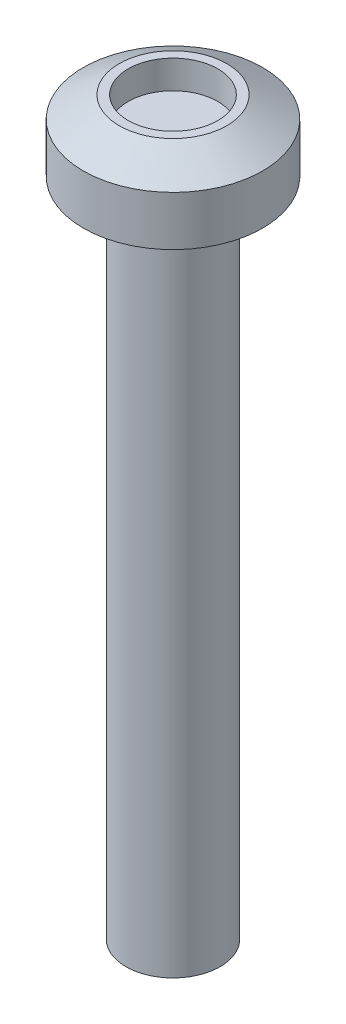
ISO-10303-21;
HEADER;
FILE_DESCRIPTION(('STEP AP214'),'2;1');
FILE_NAME('part.step','',(''),(''),'','','');
FILE_SCHEMA(('AUTOMOTIVE_DESIGN { 1 0 10303 214 1 1 1 1 }'));
ENDSEC;
DATA;
#1=APPLICATION_CONTEXT('core data for automotive mechanical design processes');
#2=APPLICATION_PROTOCOL_DEFINITION('international standard','automotive_design',2000,#1);
#3=PRODUCT_CONTEXT('',#1,'mechanical');
#4=PRODUCT('Part','Part','',(#3));
#5=PRODUCT_RELATED_PRODUCT_CATEGORY('part','',(#4));
#6=PRODUCT_DEFINITION_FORMATION('','',#4);
#7=PRODUCT_DEFINITION_CONTEXT('part definition',#1,'design');
#8=PRODUCT_DEFINITION('design','',#6,#7);
#9=PRODUCT_DEFINITION_SHAPE('','',#8);
#10=(LENGTH_UNIT() NAMED_UNIT(*) SI_UNIT(.MILLI.,.METRE.));
#11=(NAMED_UNIT(*) PLANE_ANGLE_UNIT() SI_UNIT($,.RADIAN.));
#12=(NAMED_UNIT(*) SI_UNIT($,.STERADIAN.) SOLID_ANGLE_UNIT());
#13=UNCERTAINTY_MEASURE_WITH_UNIT(LENGTH_MEASURE(1.E-05),#10,'distance_accuracy_value','');
#14=(GEOMETRIC_REPRESENTATION_CONTEXT(3) GLOBAL_UNCERTAINTY_ASSIGNED_CONTEXT((#13)) GLOBAL_UNIT_ASSIGNED_CONTEXT((#10,
#11,#12)) REPRESENTATION_CONTEXT('',''));
#15=CARTESIAN_POINT('',(0.,0.,0.));
#16=DIRECTION('',(0.,0.,1.));
#17=DIRECTION('',(1.,0.,0.));
#18=AXIS2_PLACEMENT_3D('',#15,#16,#17);
#19=CARTESIAN_POINT('',(0.,-14.,0.));
#20=DIRECTION('',(0.,-1.,0.));
#21=DIRECTION('',(0.,0.,-1.));
#22=AXIS2_PLACEMENT_3D('',#19,#20,#21);
#23=PLANE('',#22);
#24=CARTESIAN_POINT('',(0.,-14.,0.));
#25=DIRECTION('',(0.,-1.,0.));
#26=DIRECTION('',(0.,0.,-1.));
#27=AXIS2_PLACEMENT_3D('',#24,#25,#26);
#28=CIRCLE('',#27,1.);
#29=CARTESIAN_POINT('',(0.,-14.,-1.));
#30=VERTEX_POINT('',#29);
#31=EDGE_CURVE('E10',#30,#30,#28,.T.);
#32=ORIENTED_EDGE('',*,*,#31,.T.);
#33=EDGE_LOOP('',(#32));
#34=FACE_BOUND('',#33,.T.);
#35=ADVANCED_FACE('F39',(#34),#23,.T.);
#36=CARTESIAN_POINT('',(0.,-10.,0.));
#37=DIRECTION('',(0.,-1.,0.));
#38=DIRECTION('',(0.,0.,-1.));
#39=AXIS2_PLACEMENT_3D('',#36,#37,#38);
#40=CYLINDRICAL_SURFACE('',#39,1.);
#41=CARTESIAN_POINT('',(0.,0.,0.));
#42=DIRECTION('',(0.,-1.,0.));
#43=DIRECTION('',(0.,0.,-1.));
#44=AXIS2_PLACEMENT_3D('',#41,#42,#43);
#45=CIRCLE('',#44,1.);
#46=CARTESIAN_POINT('',(0.,0.,-1.));
#47=VERTEX_POINT('',#46);
#48=EDGE_CURVE('E45',#47,#47,#45,.T.);
#49=ORIENTED_EDGE('',*,*,#48,.T.);
#50=EDGE_LOOP('',(#49));
#51=FACE_BOUND('',#50,.T.);
#52=ORIENTED_EDGE('',*,*,#31,.F.);
#53=EDGE_LOOP('',(#52));
#54=FACE_BOUND('',#53,.T.);
#55=ADVANCED_FACE('F97',(#51,#54),#40,.T.);
#56=CARTESIAN_POINT('',(1.,0.,0.));
#57=DIRECTION('',(0.,-1.,0.));
#58=DIRECTION('',(0.,0.,-1.));
#59=AXIS2_PLACEMENT_3D('',#56,#57,#58);
#60=PLANE('',#59);
#61=CARTESIAN_POINT('',(0.,0.,0.));
#62=DIRECTION('',(0.,-1.,0.));
#63=DIRECTION('',(0.,0.,-1.));
#64=AXIS2_PLACEMENT_3D('',#61,#62,#63);
#65=CIRCLE('',#64,1.9);
#66=CARTESIAN_POINT('',(0.,0.,-1.9));
#67=VERTEX_POINT('',#66);
#68=EDGE_CURVE('E49',#67,#67,#65,.T.);
#69=ORIENTED_EDGE('',*,*,#68,.T.);
#70=EDGE_LOOP('',(#69));
#71=FACE_BOUND('',#70,.T.);
#72=ORIENTED_EDGE('',*,*,#48,.F.);
#73=EDGE_LOOP('',(#72));
#74=FACE_BOUND('',#73,.T.);
#75=ADVANCED_FACE('F91',(#71,#74),#60,.T.);
#76=CARTESIAN_POINT('',(0.,-10.,0.));
#77=DIRECTION('',(0.,-1.,0.));
#78=DIRECTION('',(0.,0.,-1.));
#79=AXIS2_PLACEMENT_3D('',#76,#77,#78);
#80=CYLINDRICAL_SURFACE('',#79,1.9);
#81=CARTESIAN_POINT('',(0.,1.05,0.));
#82=DIRECTION('',(0.,-1.,0.));
#83=DIRECTION('',(0.,0.,-1.));
#84=AXIS2_PLACEMENT_3D('',#81,#82,#83);
#85=CIRCLE('',#84,1.9);
#86=CARTESIAN_POINT('',(0.,1.05,-1.9));
#87=VERTEX_POINT('',#86);
#88=EDGE_CURVE('E53',#87,#87,#85,.T.);
#89=ORIENTED_EDGE('',*,*,#88,.T.);
#90=EDGE_LOOP('',(#89));
#91=FACE_BOUND('',#90,.T.);
#92=ORIENTED_EDGE('',*,*,#68,.F.);
#93=EDGE_LOOP('',(#92));
#94=FACE_BOUND('',#93,.T.);
#95=ADVANCED_FACE('F85',(#91,#94),#80,.T.);
#96=CARTESIAN_POINT('',(0.,1.05,0.));
#97=DIRECTION('',(0.,-1.,0.));
#98=DIRECTION('',(0.,0.,-1.));
#99=AXIS2_PLACEMENT_3D('',#96,#97,#98);
#100=CONICAL_SURFACE('',#99,1.9,1.0362020033539);
#101=CARTESIAN_POINT('',(0.,1.5,0.));
#102=DIRECTION('',(0.,-1.,0.));
#103=DIRECTION('',(0.,0.,-1.));
#104=AXIS2_PLACEMENT_3D('',#101,#102,#103);
#105=CIRCLE('',#104,1.14);
#106=CARTESIAN_POINT('',(0.,1.5,-1.14));
#107=VERTEX_POINT('',#106);
#108=EDGE_CURVE('E58',#107,#107,#105,.T.);
#109=ORIENTED_EDGE('',*,*,#108,.T.);
#110=EDGE_LOOP('',(#109));
#111=FACE_BOUND('',#110,.T.);
#112=ORIENTED_EDGE('',*,*,#88,.F.);
#113=EDGE_LOOP('',(#112));
#114=FACE_BOUND('',#113,.T.);
#115=ADVANCED_FACE('F79',(#111,#114),#100,.T.);
#116=CARTESIAN_POINT('',(1.14,1.5,0.));
#117=DIRECTION('',(0.,1.,0.));
#118=DIRECTION('',(0.,0.,1.));
#119=AXIS2_PLACEMENT_3D('',#116,#117,#118);
#120=PLANE('',#119);
#121=CARTESIAN_POINT('',(0.,1.5,0.));
#122=DIRECTION('',(0.,1.,0.));
#123=DIRECTION('',(0.,0.,1.));
#124=AXIS2_PLACEMENT_3D('',#121,#122,#123);
#125=CIRCLE('',#124,0.95);
#126=CARTESIAN_POINT('',(0.,1.5,0.95));
#127=VERTEX_POINT('',#126);
#128=EDGE_CURVE('E62',#127,#127,#125,.T.);
#129=ORIENTED_EDGE('',*,*,#128,.F.);
#130=EDGE_LOOP('',(#129));
#131=FACE_BOUND('',#130,.T.);
#132=ORIENTED_EDGE('',*,*,#108,.F.);
#133=EDGE_LOOP('',(#132));
#134=FACE_BOUND('',#133,.T.);
#135=ADVANCED_FACE('F73',(#131,#134),#120,.T.);
#136=CARTESIAN_POINT('',(0.,0.9,0.));
#137=DIRECTION('',(0.,1.,0.));
#138=DIRECTION('',(0.,0.,1.));
#139=AXIS2_PLACEMENT_3D('',#136,#137,#138);
#140=CYLINDRICAL_SURFACE('',#139,0.95);
#141=CARTESIAN_POINT('',(0.,0.9,0.));
#142=DIRECTION('',(0.,1.,0.));
#143=DIRECTION('',(0.,0.,1.));
#144=AXIS2_PLACEMENT_3D('',#141,#142,#143);
#145=CIRCLE('',#144,0.95);
#146=CARTESIAN_POINT('',(0.,0.9,0.95));
#147=VERTEX_POINT('',#146);
#148=EDGE_CURVE('E61',#147,#147,#145,.T.);
#149=ORIENTED_EDGE('',*,*,#148,.F.);
#150=EDGE_LOOP('',(#149));
#151=FACE_BOUND('',#150,.T.);
#152=ORIENTED_EDGE('',*,*,#128,.T.);
#153=EDGE_LOOP('',(#152));
#154=FACE_BOUND('',#153,.T.);
#155=ADVANCED_FACE('F70',(#151,#154),#140,.F.);
#156=CARTESIAN_POINT('',(0.,0.9,0.));
#157=DIRECTION('',(0.,1.,0.));
#158=DIRECTION('',(0.,0.,1.));
#159=AXIS2_PLACEMENT_3D('',#156,#157,#158);
#160=PLANE('',#159);
#161=ORIENTED_EDGE('',*,*,#148,.T.);
#162=EDGE_LOOP('',(#161));
#163=FACE_BOUND('',#162,.T.);
#164=ADVANCED_FACE('F68',(#163),#160,.T.);
#165=CLOSED_SHELL('',(#35,#55,#75,#95,#115,#135,#155,#164));
#166=MANIFOLD_SOLID_BREP('B2',#165);
#167=ADVANCED_BREP_SHAPE_REPRESENTATION('',(#18,#166),#14);
#168=SHAPE_DEFINITION_REPRESENTATION(#9,#167);
ENDSEC;
END-ISO-10303-21;
